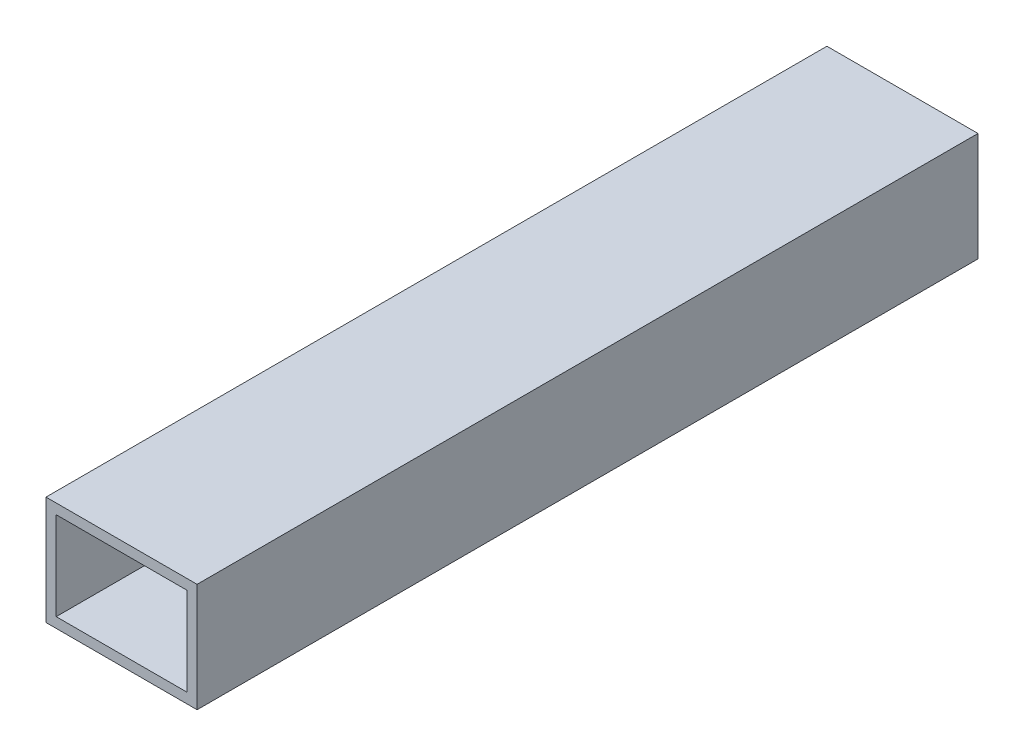
ISO-10303-21;
HEADER;
FILE_DESCRIPTION(('STEP AP214'),'2;1');
FILE_NAME('part.step','',(''),(''),'','','');
FILE_SCHEMA(('AUTOMOTIVE_DESIGN { 1 0 10303 214 1 1 1 1 }'));
ENDSEC;
DATA;
#1=APPLICATION_CONTEXT('core data for automotive mechanical design processes');
#2=APPLICATION_PROTOCOL_DEFINITION('international standard','automotive_design',2000,#1);
#3=PRODUCT_CONTEXT('',#1,'mechanical');
#4=PRODUCT('Part','Part','',(#3));
#5=PRODUCT_RELATED_PRODUCT_CATEGORY('part','',(#4));
#6=PRODUCT_DEFINITION_FORMATION('','',#4);
#7=PRODUCT_DEFINITION_CONTEXT('part definition',#1,'design');
#8=PRODUCT_DEFINITION('design','',#6,#7);
#9=PRODUCT_DEFINITION_SHAPE('','',#8);
#10=(LENGTH_UNIT() NAMED_UNIT(*) SI_UNIT(.MILLI.,.METRE.));
#11=(NAMED_UNIT(*) PLANE_ANGLE_UNIT() SI_UNIT($,.RADIAN.));
#12=(NAMED_UNIT(*) SI_UNIT($,.STERADIAN.) SOLID_ANGLE_UNIT());
#13=UNCERTAINTY_MEASURE_WITH_UNIT(LENGTH_MEASURE(1.E-05),#10,'distance_accuracy_value','');
#14=(GEOMETRIC_REPRESENTATION_CONTEXT(3) GLOBAL_UNCERTAINTY_ASSIGNED_CONTEXT((#13)) GLOBAL_UNIT_ASSIGNED_CONTEXT((#10,
#11,#12)) REPRESENTATION_CONTEXT('',''));
#15=CARTESIAN_POINT('',(0.,0.,0.));
#16=DIRECTION('',(0.,0.,1.));
#17=DIRECTION('',(1.,0.,0.));
#18=AXIS2_PLACEMENT_3D('',#15,#16,#17);
#19=CARTESIAN_POINT('',(-8.9,6.4,92.));
#20=DIRECTION('',(1.,0.,0.));
#21=DIRECTION('',(0.,0.,-1.));
#22=AXIS2_PLACEMENT_3D('',#19,#20,#21);
#23=PLANE('',#22);
#24=DIRECTION('',(0.,-1.,0.));
#25=VECTOR('',#24,1.);
#26=CARTESIAN_POINT('',(-8.9,6.4,0.));
#27=LINE('',#26,#25);
#28=CARTESIAN_POINT('',(-8.9,6.4,0.));
#29=VERTEX_POINT('',#28);
#30=CARTESIAN_POINT('',(-8.9,-6.4,0.));
#31=VERTEX_POINT('',#30);
#32=EDGE_CURVE('E154',#29,#31,#27,.T.);
#33=ORIENTED_EDGE('',*,*,#32,.T.);
#34=DIRECTION('',(0.,0.,-1.));
#35=VECTOR('',#34,1.);
#36=CARTESIAN_POINT('',(-8.9,-6.4,92.));
#37=LINE('',#36,#35);
#38=CARTESIAN_POINT('',(-8.9,-6.4,92.));
#39=VERTEX_POINT('',#38);
#40=EDGE_CURVE('E11',#39,#31,#37,.T.);
#41=ORIENTED_EDGE('',*,*,#40,.F.);
#42=DIRECTION('',(0.,-1.,0.));
#43=VECTOR('',#42,1.);
#44=CARTESIAN_POINT('',(-8.9,6.4,92.));
#45=LINE('',#44,#43);
#46=CARTESIAN_POINT('',(-8.9,6.4,92.));
#47=VERTEX_POINT('',#46);
#48=EDGE_CURVE('E161',#47,#39,#45,.T.);
#49=ORIENTED_EDGE('',*,*,#48,.F.);
#50=DIRECTION('',(0.,0.,-1.));
#51=VECTOR('',#50,1.);
#52=CARTESIAN_POINT('',(-8.9,6.4,92.));
#53=LINE('',#52,#51);
#54=EDGE_CURVE('E171',#47,#29,#53,.T.);
#55=ORIENTED_EDGE('',*,*,#54,.T.);
#56=EDGE_LOOP('',(#33,#41,#49,#55));
#57=FACE_BOUND('',#56,.T.);
#58=ADVANCED_FACE('F50',(#57),#23,.F.);
#59=CARTESIAN_POINT('',(-8.9,-6.4,92.));
#60=DIRECTION('',(0.,1.,0.));
#61=DIRECTION('',(0.,0.,1.));
#62=AXIS2_PLACEMENT_3D('',#59,#60,#61);
#63=PLANE('',#62);
#64=DIRECTION('',(1.,0.,0.));
#65=VECTOR('',#64,1.);
#66=CARTESIAN_POINT('',(-8.9,-6.4,0.));
#67=LINE('',#66,#65);
#68=CARTESIAN_POINT('',(8.9,-6.4,0.));
#69=VERTEX_POINT('',#68);
#70=EDGE_CURVE('E180',#31,#69,#67,.T.);
#71=ORIENTED_EDGE('',*,*,#70,.T.);
#72=DIRECTION('',(0.,0.,-1.));
#73=VECTOR('',#72,1.);
#74=CARTESIAN_POINT('',(8.9,-6.4,92.));
#75=LINE('',#74,#73);
#76=CARTESIAN_POINT('',(8.9,-6.4,92.));
#77=VERTEX_POINT('',#76);
#78=EDGE_CURVE('E54',#77,#69,#75,.T.);
#79=ORIENTED_EDGE('',*,*,#78,.F.);
#80=DIRECTION('',(1.,0.,0.));
#81=VECTOR('',#80,1.);
#82=CARTESIAN_POINT('',(-8.9,-6.4,92.));
#83=LINE('',#82,#81);
#84=EDGE_CURVE('E164',#39,#77,#83,.T.);
#85=ORIENTED_EDGE('',*,*,#84,.F.);
#86=ORIENTED_EDGE('',*,*,#40,.T.);
#87=EDGE_LOOP('',(#71,#79,#85,#86));
#88=FACE_BOUND('',#87,.T.);
#89=ADVANCED_FACE('F207',(#88),#63,.F.);
#90=CARTESIAN_POINT('',(8.9,-6.4,92.));
#91=DIRECTION('',(-1.,0.,0.));
#92=DIRECTION('',(0.,0.,1.));
#93=AXIS2_PLACEMENT_3D('',#90,#91,#92);
#94=PLANE('',#93);
#95=DIRECTION('',(0.,1.,0.));
#96=VECTOR('',#95,1.);
#97=CARTESIAN_POINT('',(8.9,-6.4,0.));
#98=LINE('',#97,#96);
#99=CARTESIAN_POINT('',(8.9,6.4,0.));
#100=VERTEX_POINT('',#99);
#101=EDGE_CURVE('E178',#69,#100,#98,.T.);
#102=ORIENTED_EDGE('',*,*,#101,.T.);
#103=DIRECTION('',(0.,0.,-1.));
#104=VECTOR('',#103,1.);
#105=CARTESIAN_POINT('',(8.9,6.4,92.));
#106=LINE('',#105,#104);
#107=CARTESIAN_POINT('',(8.9,6.4,92.));
#108=VERTEX_POINT('',#107);
#109=EDGE_CURVE('E188',#108,#100,#106,.T.);
#110=ORIENTED_EDGE('',*,*,#109,.F.);
#111=DIRECTION('',(0.,1.,0.));
#112=VECTOR('',#111,1.);
#113=CARTESIAN_POINT('',(8.9,-6.4,92.));
#114=LINE('',#113,#112);
#115=EDGE_CURVE('E166',#77,#108,#114,.T.);
#116=ORIENTED_EDGE('',*,*,#115,.F.);
#117=ORIENTED_EDGE('',*,*,#78,.T.);
#118=EDGE_LOOP('',(#102,#110,#116,#117));
#119=FACE_BOUND('',#118,.T.);
#120=ADVANCED_FACE('F193',(#119),#94,.F.);
#121=CARTESIAN_POINT('',(8.9,6.4,92.));
#122=DIRECTION('',(0.,-1.,0.));
#123=DIRECTION('',(0.,0.,-1.));
#124=AXIS2_PLACEMENT_3D('',#121,#122,#123);
#125=PLANE('',#124);
#126=DIRECTION('',(-1.,0.,0.));
#127=VECTOR('',#126,1.);
#128=CARTESIAN_POINT('',(8.9,6.4,0.));
#129=LINE('',#128,#127);
#130=EDGE_CURVE('E167',#100,#29,#129,.T.);
#131=ORIENTED_EDGE('',*,*,#130,.T.);
#132=ORIENTED_EDGE('',*,*,#54,.F.);
#133=DIRECTION('',(-1.,0.,0.));
#134=VECTOR('',#133,1.);
#135=CARTESIAN_POINT('',(8.9,6.4,92.));
#136=LINE('',#135,#134);
#137=EDGE_CURVE('E174',#108,#47,#136,.T.);
#138=ORIENTED_EDGE('',*,*,#137,.F.);
#139=ORIENTED_EDGE('',*,*,#109,.T.);
#140=EDGE_LOOP('',(#131,#132,#138,#139));
#141=FACE_BOUND('',#140,.T.);
#142=ADVANCED_FACE('F205',(#141),#125,.F.);
#143=CARTESIAN_POINT('',(0.,0.,92.));
#144=DIRECTION('',(0.,0.,1.));
#145=DIRECTION('',(1.,0.,0.));
#146=AXIS2_PLACEMENT_3D('',#143,#144,#145);
#147=PLANE('',#146);
#148=DIRECTION('',(0.,-1.,0.));
#149=VECTOR('',#148,1.);
#150=CARTESIAN_POINT('',(-7.7,5.2,92.));
#151=LINE('',#150,#149);
#152=CARTESIAN_POINT('',(-7.7,5.2,92.));
#153=VERTEX_POINT('',#152);
#154=CARTESIAN_POINT('',(-7.7,-5.2,92.));
#155=VERTEX_POINT('',#154);
#156=EDGE_CURVE('E64',#153,#155,#151,.T.);
#157=ORIENTED_EDGE('',*,*,#156,.F.);
#158=DIRECTION('',(-1.,0.,0.));
#159=VECTOR('',#158,1.);
#160=CARTESIAN_POINT('',(7.7,5.2,92.));
#161=LINE('',#160,#159);
#162=CARTESIAN_POINT('',(7.7,5.2,92.));
#163=VERTEX_POINT('',#162);
#164=EDGE_CURVE('E132',#163,#153,#161,.T.);
#165=ORIENTED_EDGE('',*,*,#164,.F.);
#166=DIRECTION('',(0.,1.,0.));
#167=VECTOR('',#166,1.);
#168=CARTESIAN_POINT('',(7.7,-5.2,92.));
#169=LINE('',#168,#167);
#170=CARTESIAN_POINT('',(7.7,-5.2,92.));
#171=VERTEX_POINT('',#170);
#172=EDGE_CURVE('E140',#171,#163,#169,.T.);
#173=ORIENTED_EDGE('',*,*,#172,.F.);
#174=DIRECTION('',(1.,0.,0.));
#175=VECTOR('',#174,1.);
#176=CARTESIAN_POINT('',(-7.7,-5.2,92.));
#177=LINE('',#176,#175);
#178=EDGE_CURVE('E148',#155,#171,#177,.T.);
#179=ORIENTED_EDGE('',*,*,#178,.F.);
#180=EDGE_LOOP('',(#157,#165,#173,#179));
#181=FACE_BOUND('',#180,.T.);
#182=ORIENTED_EDGE('',*,*,#48,.T.);
#183=ORIENTED_EDGE('',*,*,#84,.T.);
#184=ORIENTED_EDGE('',*,*,#115,.T.);
#185=ORIENTED_EDGE('',*,*,#137,.T.);
#186=EDGE_LOOP('',(#182,#183,#184,#185));
#187=FACE_BOUND('',#186,.T.);
#188=ADVANCED_FACE('F208',(#181,#187),#147,.T.);
#189=CARTESIAN_POINT('',(0.,0.,0.));
#190=DIRECTION('',(0.,0.,1.));
#191=DIRECTION('',(1.,0.,0.));
#192=AXIS2_PLACEMENT_3D('',#189,#190,#191);
#193=PLANE('',#192);
#194=DIRECTION('',(-1.,0.,0.));
#195=VECTOR('',#194,1.);
#196=CARTESIAN_POINT('',(7.7,5.2,0.));
#197=LINE('',#196,#195);
#198=CARTESIAN_POINT('',(7.7,5.2,0.));
#199=VERTEX_POINT('',#198);
#200=CARTESIAN_POINT('',(-7.7,5.2,0.));
#201=VERTEX_POINT('',#200);
#202=EDGE_CURVE('E122',#199,#201,#197,.T.);
#203=ORIENTED_EDGE('',*,*,#202,.T.);
#204=DIRECTION('',(0.,-1.,0.));
#205=VECTOR('',#204,1.);
#206=CARTESIAN_POINT('',(-7.7,5.2,0.));
#207=LINE('',#206,#205);
#208=CARTESIAN_POINT('',(-7.7,-5.2,0.));
#209=VERTEX_POINT('',#208);
#210=EDGE_CURVE('E111',#201,#209,#207,.T.);
#211=ORIENTED_EDGE('',*,*,#210,.T.);
#212=DIRECTION('',(1.,0.,0.));
#213=VECTOR('',#212,1.);
#214=CARTESIAN_POINT('',(-7.7,-5.2,0.));
#215=LINE('',#214,#213);
#216=CARTESIAN_POINT('',(7.7,-5.2,0.));
#217=VERTEX_POINT('',#216);
#218=EDGE_CURVE('E121',#209,#217,#215,.T.);
#219=ORIENTED_EDGE('',*,*,#218,.T.);
#220=DIRECTION('',(0.,1.,0.));
#221=VECTOR('',#220,1.);
#222=CARTESIAN_POINT('',(7.7,-5.2,0.));
#223=LINE('',#222,#221);
#224=EDGE_CURVE('E68',#217,#199,#223,.T.);
#225=ORIENTED_EDGE('',*,*,#224,.T.);
#226=EDGE_LOOP('',(#203,#211,#219,#225));
#227=FACE_BOUND('',#226,.T.);
#228=ORIENTED_EDGE('',*,*,#32,.F.);
#229=ORIENTED_EDGE('',*,*,#130,.F.);
#230=ORIENTED_EDGE('',*,*,#101,.F.);
#231=ORIENTED_EDGE('',*,*,#70,.F.);
#232=EDGE_LOOP('',(#228,#229,#230,#231));
#233=FACE_BOUND('',#232,.T.);
#234=ADVANCED_FACE('F129',(#227,#233),#193,.F.);
#235=CARTESIAN_POINT('',(-7.7,5.2,0.));
#236=DIRECTION('',(-1.,0.,0.));
#237=DIRECTION('',(0.,0.,1.));
#238=AXIS2_PLACEMENT_3D('',#235,#236,#237);
#239=PLANE('',#238);
#240=ORIENTED_EDGE('',*,*,#156,.T.);
#241=DIRECTION('',(0.,0.,1.));
#242=VECTOR('',#241,1.);
#243=CARTESIAN_POINT('',(-7.7,-5.2,0.));
#244=LINE('',#243,#242);
#245=EDGE_CURVE('E109',#209,#155,#244,.T.);
#246=ORIENTED_EDGE('',*,*,#245,.F.);
#247=ORIENTED_EDGE('',*,*,#210,.F.);
#248=DIRECTION('',(0.,0.,1.));
#249=VECTOR('',#248,1.);
#250=CARTESIAN_POINT('',(-7.7,5.2,0.));
#251=LINE('',#250,#249);
#252=EDGE_CURVE('E155',#201,#153,#251,.T.);
#253=ORIENTED_EDGE('',*,*,#252,.T.);
#254=EDGE_LOOP('',(#240,#246,#247,#253));
#255=FACE_BOUND('',#254,.T.);
#256=ADVANCED_FACE('F115',(#255),#239,.F.);
#257=CARTESIAN_POINT('',(7.7,5.2,0.));
#258=DIRECTION('',(0.,1.,0.));
#259=DIRECTION('',(0.,0.,1.));
#260=AXIS2_PLACEMENT_3D('',#257,#258,#259);
#261=PLANE('',#260);
#262=ORIENTED_EDGE('',*,*,#164,.T.);
#263=ORIENTED_EDGE('',*,*,#252,.F.);
#264=ORIENTED_EDGE('',*,*,#202,.F.);
#265=DIRECTION('',(0.,0.,1.));
#266=VECTOR('',#265,1.);
#267=CARTESIAN_POINT('',(7.7,5.2,0.));
#268=LINE('',#267,#266);
#269=EDGE_CURVE('E156',#199,#163,#268,.T.);
#270=ORIENTED_EDGE('',*,*,#269,.T.);
#271=EDGE_LOOP('',(#262,#263,#264,#270));
#272=FACE_BOUND('',#271,.T.);
#273=ADVANCED_FACE('F223',(#272),#261,.F.);
#274=CARTESIAN_POINT('',(7.7,-5.2,0.));
#275=DIRECTION('',(1.,0.,0.));
#276=DIRECTION('',(0.,0.,-1.));
#277=AXIS2_PLACEMENT_3D('',#274,#275,#276);
#278=PLANE('',#277);
#279=ORIENTED_EDGE('',*,*,#172,.T.);
#280=ORIENTED_EDGE('',*,*,#269,.F.);
#281=ORIENTED_EDGE('',*,*,#224,.F.);
#282=DIRECTION('',(0.,0.,1.));
#283=VECTOR('',#282,1.);
#284=CARTESIAN_POINT('',(7.7,-5.2,0.));
#285=LINE('',#284,#283);
#286=EDGE_CURVE('E116',#217,#171,#285,.T.);
#287=ORIENTED_EDGE('',*,*,#286,.T.);
#288=EDGE_LOOP('',(#279,#280,#281,#287));
#289=FACE_BOUND('',#288,.T.);
#290=ADVANCED_FACE('F227',(#289),#278,.F.);
#291=CARTESIAN_POINT('',(-7.7,-5.2,0.));
#292=DIRECTION('',(0.,-1.,0.));
#293=DIRECTION('',(0.,0.,-1.));
#294=AXIS2_PLACEMENT_3D('',#291,#292,#293);
#295=PLANE('',#294);
#296=ORIENTED_EDGE('',*,*,#178,.T.);
#297=ORIENTED_EDGE('',*,*,#286,.F.);
#298=ORIENTED_EDGE('',*,*,#218,.F.);
#299=ORIENTED_EDGE('',*,*,#245,.T.);
#300=EDGE_LOOP('',(#296,#297,#298,#299));
#301=FACE_BOUND('',#300,.T.);
#302=ADVANCED_FACE('F123',(#301),#295,.F.);
#303=CLOSED_SHELL('',(#58,#89,#120,#142,#188,#234,#256,#273,#290,#302));
#304=MANIFOLD_SOLID_BREP('B2',#303);
#305=ADVANCED_BREP_SHAPE_REPRESENTATION('',(#18,#304),#14);
#306=SHAPE_DEFINITION_REPRESENTATION(#9,#305);
ENDSEC;
END-ISO-10303-21;
